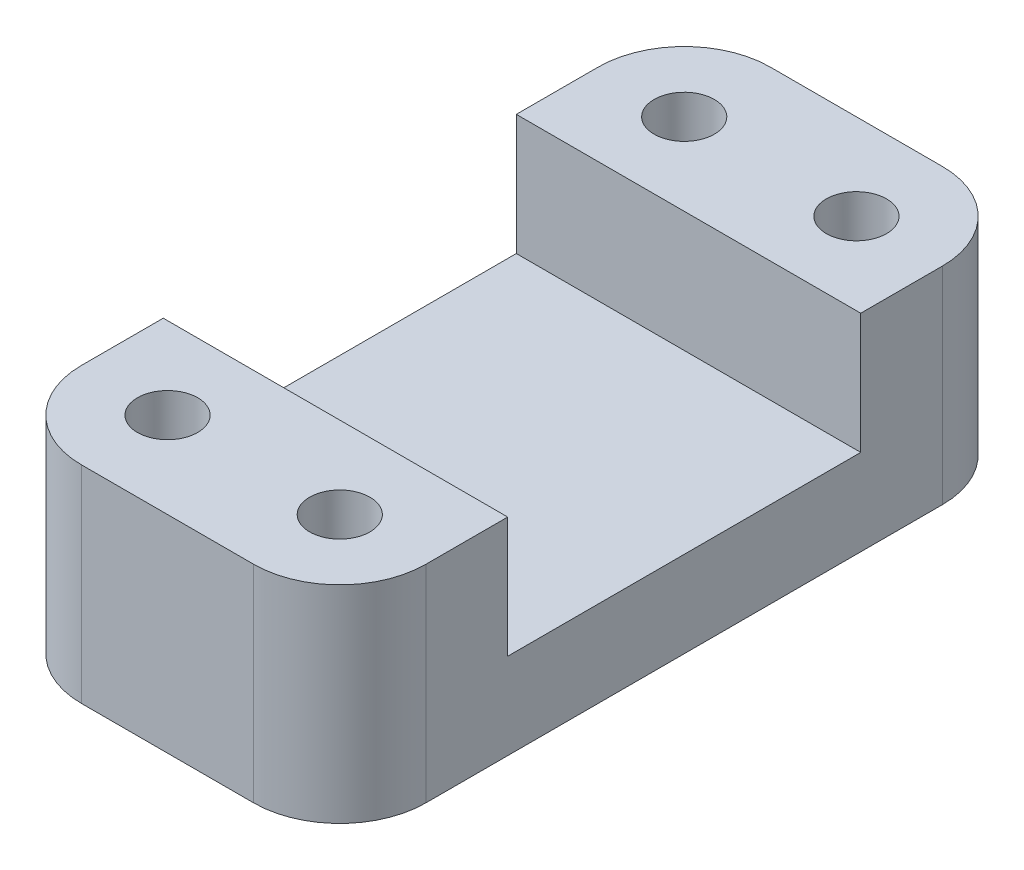
ISO-10303-21;
HEADER;
FILE_DESCRIPTION(('STEP AP214'),'2;1');
FILE_NAME('part.step','',(''),(''),'','','');
FILE_SCHEMA(('AUTOMOTIVE_DESIGN { 1 0 10303 214 1 1 1 1 }'));
ENDSEC;
DATA;
#1=APPLICATION_CONTEXT('core data for automotive mechanical design processes');
#2=APPLICATION_PROTOCOL_DEFINITION('international standard','automotive_design',2000,#1);
#3=PRODUCT_CONTEXT('',#1,'mechanical');
#4=PRODUCT('Part','Part','',(#3));
#5=PRODUCT_RELATED_PRODUCT_CATEGORY('part','',(#4));
#6=PRODUCT_DEFINITION_FORMATION('','',#4);
#7=PRODUCT_DEFINITION_CONTEXT('part definition',#1,'design');
#8=PRODUCT_DEFINITION('design','',#6,#7);
#9=PRODUCT_DEFINITION_SHAPE('','',#8);
#10=(LENGTH_UNIT() NAMED_UNIT(*) SI_UNIT(.MILLI.,.METRE.));
#11=(NAMED_UNIT(*) PLANE_ANGLE_UNIT() SI_UNIT($,.RADIAN.));
#12=(NAMED_UNIT(*) SI_UNIT($,.STERADIAN.) SOLID_ANGLE_UNIT());
#13=UNCERTAINTY_MEASURE_WITH_UNIT(LENGTH_MEASURE(1.E-05),#10,'distance_accuracy_value','');
#14=(GEOMETRIC_REPRESENTATION_CONTEXT(3) GLOBAL_UNCERTAINTY_ASSIGNED_CONTEXT((#13)) GLOBAL_UNIT_ASSIGNED_CONTEXT((#10,
#11,#12)) REPRESENTATION_CONTEXT('',''));
#15=CARTESIAN_POINT('',(0.,0.,0.));
#16=DIRECTION('',(0.,0.,1.));
#17=DIRECTION('',(1.,0.,0.));
#18=AXIS2_PLACEMENT_3D('',#15,#16,#17);
#19=CARTESIAN_POINT('',(0.,5.,0.));
#20=DIRECTION('',(0.,-1.,0.));
#21=DIRECTION('',(0.,0.,-1.));
#22=AXIS2_PLACEMENT_3D('',#19,#20,#21);
#23=PLANE('',#22);
#24=DIRECTION('',(1.,0.,0.));
#25=VECTOR('',#24,1.);
#26=CARTESIAN_POINT('',(10.,5.,-10.25));
#27=LINE('',#26,#25);
#28=CARTESIAN_POINT('',(-10.,5.,-10.25));
#29=VERTEX_POINT('',#28);
#30=CARTESIAN_POINT('',(10.,5.,-10.25));
#31=VERTEX_POINT('',#30);
#32=EDGE_CURVE('E153',#29,#31,#27,.T.);
#33=ORIENTED_EDGE('',*,*,#32,.F.);
#34=DIRECTION('',(0.,0.,1.));
#35=VECTOR('',#34,1.);
#36=CARTESIAN_POINT('',(-10.,5.,20.));
#37=LINE('',#36,#35);
#38=CARTESIAN_POINT('',(-10.,5.,10.25));
#39=VERTEX_POINT('',#38);
#40=EDGE_CURVE('E139',#29,#39,#37,.T.);
#41=ORIENTED_EDGE('',*,*,#40,.T.);
#42=DIRECTION('',(-1.,0.,0.));
#43=VECTOR('',#42,1.);
#44=CARTESIAN_POINT('',(-10.,5.,10.25));
#45=LINE('',#44,#43);
#46=CARTESIAN_POINT('',(10.,5.,10.25));
#47=VERTEX_POINT('',#46);
#48=EDGE_CURVE('E143',#47,#39,#45,.T.);
#49=ORIENTED_EDGE('',*,*,#48,.F.);
#50=DIRECTION('',(0.,0.,-1.));
#51=VECTOR('',#50,1.);
#52=CARTESIAN_POINT('',(10.,5.,20.));
#53=LINE('',#52,#51);
#54=EDGE_CURVE('E173',#47,#31,#53,.T.);
#55=ORIENTED_EDGE('',*,*,#54,.T.);
#56=EDGE_LOOP('',(#33,#41,#49,#55));
#57=FACE_BOUND('',#56,.T.);
#58=ADVANCED_FACE('F32',(#57),#23,.F.);
#59=CARTESIAN_POINT('',(10.,5.,20.));
#60=DIRECTION('',(-1.,0.,0.));
#61=DIRECTION('',(0.,0.,1.));
#62=AXIS2_PLACEMENT_3D('',#59,#60,#61);
#63=PLANE('',#62);
#64=DIRECTION('',(0.,0.,-1.));
#65=VECTOR('',#64,1.);
#66=CARTESIAN_POINT('',(10.,0.,20.));
#67=LINE('',#66,#65);
#68=CARTESIAN_POINT('',(10.,0.,15.));
#69=VERTEX_POINT('',#68);
#70=CARTESIAN_POINT('',(10.,0.,-15.));
#71=VERTEX_POINT('',#70);
#72=EDGE_CURVE('E172',#69,#71,#67,.T.);
#73=ORIENTED_EDGE('',*,*,#72,.T.);
#74=DIRECTION('',(0.,-1.,0.));
#75=VECTOR('',#74,1.);
#76=CARTESIAN_POINT('',(10.,5.,-15.));
#77=LINE('',#76,#75);
#78=CARTESIAN_POINT('',(10.,12.,-15.));
#79=VERTEX_POINT('',#78);
#80=EDGE_CURVE('E222',#71,#79,#77,.F.);
#81=ORIENTED_EDGE('',*,*,#80,.T.);
#82=DIRECTION('',(0.,0.,-1.));
#83=VECTOR('',#82,1.);
#84=CARTESIAN_POINT('',(10.,12.,-20.));
#85=LINE('',#84,#83);
#86=CARTESIAN_POINT('',(10.,12.,-10.25));
#87=VERTEX_POINT('',#86);
#88=EDGE_CURVE('E154',#87,#79,#85,.T.);
#89=ORIENTED_EDGE('',*,*,#88,.F.);
#90=DIRECTION('',(0.,-1.,0.));
#91=VECTOR('',#90,1.);
#92=CARTESIAN_POINT('',(10.,12.,-10.25));
#93=LINE('',#92,#91);
#94=EDGE_CURVE('E144',#87,#31,#93,.T.);
#95=ORIENTED_EDGE('',*,*,#94,.T.);
#96=ORIENTED_EDGE('',*,*,#54,.F.);
#97=DIRECTION('',(0.,-1.,0.));
#98=VECTOR('',#97,1.);
#99=CARTESIAN_POINT('',(10.,12.,10.25));
#100=LINE('',#99,#98);
#101=CARTESIAN_POINT('',(10.,12.,10.25));
#102=VERTEX_POINT('',#101);
#103=EDGE_CURVE('E169',#102,#47,#100,.T.);
#104=ORIENTED_EDGE('',*,*,#103,.F.);
#105=DIRECTION('',(0.,0.,-1.));
#106=VECTOR('',#105,1.);
#107=CARTESIAN_POINT('',(10.,12.,20.));
#108=LINE('',#107,#106);
#109=CARTESIAN_POINT('',(10.,12.,15.));
#110=VERTEX_POINT('',#109);
#111=EDGE_CURVE('E161',#110,#102,#108,.T.);
#112=ORIENTED_EDGE('',*,*,#111,.F.);
#113=DIRECTION('',(0.,-1.,0.));
#114=VECTOR('',#113,1.);
#115=CARTESIAN_POINT('',(10.,5.,15.));
#116=LINE('',#115,#114);
#117=EDGE_CURVE('E219',#110,#69,#116,.T.);
#118=ORIENTED_EDGE('',*,*,#117,.T.);
#119=EDGE_LOOP('',(#73,#81,#89,#95,#96,#104,#112,#118));
#120=FACE_BOUND('',#119,.T.);
#121=ADVANCED_FACE('F241',(#120),#63,.F.);
#122=CARTESIAN_POINT('',(-10.,5.,-20.));
#123=DIRECTION('',(0.,0.,1.));
#124=DIRECTION('',(1.,0.,0.));
#125=AXIS2_PLACEMENT_3D('',#122,#123,#124);
#126=PLANE('',#125);
#127=DIRECTION('',(-1.,0.,0.));
#128=VECTOR('',#127,1.);
#129=CARTESIAN_POINT('',(10.,12.,-20.));
#130=LINE('',#129,#128);
#131=CARTESIAN_POINT('',(5.,12.,-20.));
#132=VERTEX_POINT('',#131);
#133=CARTESIAN_POINT('',(-5.,12.,-20.));
#134=VERTEX_POINT('',#133);
#135=EDGE_CURVE('E133',#132,#134,#130,.T.);
#136=ORIENTED_EDGE('',*,*,#135,.F.);
#137=DIRECTION('',(0.,-1.,0.));
#138=VECTOR('',#137,1.);
#139=CARTESIAN_POINT('',(5.,5.,-20.));
#140=LINE('',#139,#138);
#141=CARTESIAN_POINT('',(5.,0.,-20.));
#142=VERTEX_POINT('',#141);
#143=EDGE_CURVE('E208',#132,#142,#140,.T.);
#144=ORIENTED_EDGE('',*,*,#143,.T.);
#145=DIRECTION('',(-1.,0.,0.));
#146=VECTOR('',#145,1.);
#147=CARTESIAN_POINT('',(-10.,0.,-20.));
#148=LINE('',#147,#146);
#149=CARTESIAN_POINT('',(-5.,0.,-20.));
#150=VERTEX_POINT('',#149);
#151=EDGE_CURVE('E180',#142,#150,#148,.T.);
#152=ORIENTED_EDGE('',*,*,#151,.T.);
#153=DIRECTION('',(0.,-1.,0.));
#154=VECTOR('',#153,1.);
#155=CARTESIAN_POINT('',(-5.,5.,-20.));
#156=LINE('',#155,#154);
#157=EDGE_CURVE('E177',#150,#134,#156,.F.);
#158=ORIENTED_EDGE('',*,*,#157,.T.);
#159=EDGE_LOOP('',(#136,#144,#152,#158));
#160=FACE_BOUND('',#159,.T.);
#161=ADVANCED_FACE('F261',(#160),#126,.F.);
#162=CARTESIAN_POINT('',(-10.,5.,20.));
#163=DIRECTION('',(1.,0.,0.));
#164=DIRECTION('',(0.,0.,-1.));
#165=AXIS2_PLACEMENT_3D('',#162,#163,#164);
#166=PLANE('',#165);
#167=DIRECTION('',(0.,0.,1.));
#168=VECTOR('',#167,1.);
#169=CARTESIAN_POINT('',(-10.,12.,-20.));
#170=LINE('',#169,#168);
#171=CARTESIAN_POINT('',(-10.,12.,-15.));
#172=VERTEX_POINT('',#171);
#173=CARTESIAN_POINT('',(-10.,12.,-10.25));
#174=VERTEX_POINT('',#173);
#175=EDGE_CURVE('E120',#172,#174,#170,.T.);
#176=ORIENTED_EDGE('',*,*,#175,.F.);
#177=DIRECTION('',(0.,-1.,0.));
#178=VECTOR('',#177,1.);
#179=CARTESIAN_POINT('',(-10.,5.,-15.));
#180=LINE('',#179,#178);
#181=CARTESIAN_POINT('',(-10.,0.,-15.));
#182=VERTEX_POINT('',#181);
#183=EDGE_CURVE('E229',#172,#182,#180,.T.);
#184=ORIENTED_EDGE('',*,*,#183,.T.);
#185=DIRECTION('',(0.,0.,1.));
#186=VECTOR('',#185,1.);
#187=CARTESIAN_POINT('',(-10.,0.,20.));
#188=LINE('',#187,#186);
#189=CARTESIAN_POINT('',(-10.,0.,15.));
#190=VERTEX_POINT('',#189);
#191=EDGE_CURVE('E183',#182,#190,#188,.T.);
#192=ORIENTED_EDGE('',*,*,#191,.T.);
#193=DIRECTION('',(0.,-1.,0.));
#194=VECTOR('',#193,1.);
#195=CARTESIAN_POINT('',(-10.,5.,15.));
#196=LINE('',#195,#194);
#197=CARTESIAN_POINT('',(-10.,12.,15.));
#198=VERTEX_POINT('',#197);
#199=EDGE_CURVE('E227',#190,#198,#196,.F.);
#200=ORIENTED_EDGE('',*,*,#199,.T.);
#201=DIRECTION('',(0.,0.,1.));
#202=VECTOR('',#201,1.);
#203=CARTESIAN_POINT('',(-10.,12.,20.));
#204=LINE('',#203,#202);
#205=CARTESIAN_POINT('',(-10.,12.,10.25));
#206=VERTEX_POINT('',#205);
#207=EDGE_CURVE('E157',#206,#198,#204,.T.);
#208=ORIENTED_EDGE('',*,*,#207,.F.);
#209=DIRECTION('',(0.,-1.,0.));
#210=VECTOR('',#209,1.);
#211=CARTESIAN_POINT('',(-10.,12.,10.25));
#212=LINE('',#211,#210);
#213=EDGE_CURVE('E165',#206,#39,#212,.T.);
#214=ORIENTED_EDGE('',*,*,#213,.T.);
#215=ORIENTED_EDGE('',*,*,#40,.F.);
#216=DIRECTION('',(0.,-1.,0.));
#217=VECTOR('',#216,1.);
#218=CARTESIAN_POINT('',(-10.,12.,-10.25));
#219=LINE('',#218,#217);
#220=EDGE_CURVE('E136',#174,#29,#219,.T.);
#221=ORIENTED_EDGE('',*,*,#220,.F.);
#222=EDGE_LOOP('',(#176,#184,#192,#200,#208,#214,#215,#221));
#223=FACE_BOUND('',#222,.T.);
#224=ADVANCED_FACE('F137',(#223),#166,.F.);
#225=CARTESIAN_POINT('',(-10.,5.,20.));
#226=DIRECTION('',(0.,0.,-1.));
#227=DIRECTION('',(-1.,0.,0.));
#228=AXIS2_PLACEMENT_3D('',#225,#226,#227);
#229=PLANE('',#228);
#230=DIRECTION('',(1.,0.,0.));
#231=VECTOR('',#230,1.);
#232=CARTESIAN_POINT('',(-10.,12.,20.));
#233=LINE('',#232,#231);
#234=CARTESIAN_POINT('',(-5.,12.,20.));
#235=VERTEX_POINT('',#234);
#236=CARTESIAN_POINT('',(5.,12.,20.));
#237=VERTEX_POINT('',#236);
#238=EDGE_CURVE('E159',#235,#237,#233,.T.);
#239=ORIENTED_EDGE('',*,*,#238,.F.);
#240=DIRECTION('',(0.,-1.,0.));
#241=VECTOR('',#240,1.);
#242=CARTESIAN_POINT('',(-5.,5.,20.));
#243=LINE('',#242,#241);
#244=CARTESIAN_POINT('',(-5.,0.,20.));
#245=VERTEX_POINT('',#244);
#246=EDGE_CURVE('E232',#235,#245,#243,.T.);
#247=ORIENTED_EDGE('',*,*,#246,.T.);
#248=DIRECTION('',(1.,0.,0.));
#249=VECTOR('',#248,1.);
#250=CARTESIAN_POINT('',(-10.,0.,20.));
#251=LINE('',#250,#249);
#252=CARTESIAN_POINT('',(5.,0.,20.));
#253=VERTEX_POINT('',#252);
#254=EDGE_CURVE('E175',#245,#253,#251,.T.);
#255=ORIENTED_EDGE('',*,*,#254,.T.);
#256=DIRECTION('',(0.,-1.,0.));
#257=VECTOR('',#256,1.);
#258=CARTESIAN_POINT('',(5.,5.,20.));
#259=LINE('',#258,#257);
#260=EDGE_CURVE('E47',#253,#237,#259,.F.);
#261=ORIENTED_EDGE('',*,*,#260,.T.);
#262=EDGE_LOOP('',(#239,#247,#255,#261));
#263=FACE_BOUND('',#262,.T.);
#264=ADVANCED_FACE('F249',(#263),#229,.F.);
#265=CARTESIAN_POINT('',(0.,0.,0.));
#266=DIRECTION('',(0.,-1.,0.));
#267=DIRECTION('',(0.,0.,-1.));
#268=AXIS2_PLACEMENT_3D('',#265,#266,#267);
#269=PLANE('',#268);
#270=CARTESIAN_POINT('',(5.,0.,15.));
#271=DIRECTION('',(0.,-1.,0.));
#272=DIRECTION('',(0.,0.,-1.));
#273=AXIS2_PLACEMENT_3D('',#270,#271,#272);
#274=CIRCLE('',#273,3.25);
#275=CARTESIAN_POINT('',(5.,0.,11.75));
#276=VERTEX_POINT('',#275);
#277=EDGE_CURVE('E293',#276,#276,#274,.T.);
#278=ORIENTED_EDGE('',*,*,#277,.F.);
#279=EDGE_LOOP('',(#278));
#280=FACE_BOUND('',#279,.T.);
#281=CARTESIAN_POINT('',(-5.,0.,15.));
#282=DIRECTION('',(0.,-1.,0.));
#283=DIRECTION('',(0.,0.,-1.));
#284=AXIS2_PLACEMENT_3D('',#281,#282,#283);
#285=CIRCLE('',#284,3.25);
#286=CARTESIAN_POINT('',(-5.,0.,11.75));
#287=VERTEX_POINT('',#286);
#288=EDGE_CURVE('E205',#287,#287,#285,.T.);
#289=ORIENTED_EDGE('',*,*,#288,.F.);
#290=EDGE_LOOP('',(#289));
#291=FACE_BOUND('',#290,.T.);
#292=CARTESIAN_POINT('',(-5.,0.,-15.));
#293=DIRECTION('',(0.,-1.,0.));
#294=DIRECTION('',(0.,0.,-1.));
#295=AXIS2_PLACEMENT_3D('',#292,#293,#294);
#296=CIRCLE('',#295,3.25);
#297=CARTESIAN_POINT('',(-5.,0.,-18.25));
#298=VERTEX_POINT('',#297);
#299=EDGE_CURVE('E200',#298,#298,#296,.T.);
#300=ORIENTED_EDGE('',*,*,#299,.F.);
#301=EDGE_LOOP('',(#300));
#302=FACE_BOUND('',#301,.T.);
#303=CARTESIAN_POINT('',(5.,0.,-15.));
#304=DIRECTION('',(0.,-1.,0.));
#305=DIRECTION('',(0.,0.,-1.));
#306=AXIS2_PLACEMENT_3D('',#303,#304,#305);
#307=CIRCLE('',#306,3.25);
#308=CARTESIAN_POINT('',(5.,0.,-18.25));
#309=VERTEX_POINT('',#308);
#310=EDGE_CURVE('E195',#309,#309,#307,.T.);
#311=ORIENTED_EDGE('',*,*,#310,.F.);
#312=EDGE_LOOP('',(#311));
#313=FACE_BOUND('',#312,.T.);
#314=ORIENTED_EDGE('',*,*,#151,.F.);
#315=CARTESIAN_POINT('',(5.,0.,-15.));
#316=DIRECTION('',(0.,-1.,0.));
#317=DIRECTION('',(0.,0.,-1.));
#318=AXIS2_PLACEMENT_3D('',#315,#316,#317);
#319=CIRCLE('',#318,5.);
#320=EDGE_CURVE('E217',#142,#71,#319,.T.);
#321=ORIENTED_EDGE('',*,*,#320,.T.);
#322=ORIENTED_EDGE('',*,*,#72,.F.);
#323=CARTESIAN_POINT('',(5.,0.,15.));
#324=DIRECTION('',(0.,-1.,0.));
#325=DIRECTION('',(0.,0.,-1.));
#326=AXIS2_PLACEMENT_3D('',#323,#324,#325);
#327=CIRCLE('',#326,5.);
#328=EDGE_CURVE('E211',#69,#253,#327,.T.);
#329=ORIENTED_EDGE('',*,*,#328,.T.);
#330=ORIENTED_EDGE('',*,*,#254,.F.);
#331=CARTESIAN_POINT('',(-5.,0.,15.));
#332=DIRECTION('',(0.,-1.,0.));
#333=DIRECTION('',(0.,0.,-1.));
#334=AXIS2_PLACEMENT_3D('',#331,#332,#333);
#335=CIRCLE('',#334,5.);
#336=EDGE_CURVE('E213',#245,#190,#335,.T.);
#337=ORIENTED_EDGE('',*,*,#336,.T.);
#338=ORIENTED_EDGE('',*,*,#191,.F.);
#339=CARTESIAN_POINT('',(-5.,0.,-15.));
#340=DIRECTION('',(0.,-1.,0.));
#341=DIRECTION('',(0.,0.,-1.));
#342=AXIS2_PLACEMENT_3D('',#339,#340,#341);
#343=CIRCLE('',#342,5.);
#344=EDGE_CURVE('E215',#182,#150,#343,.T.);
#345=ORIENTED_EDGE('',*,*,#344,.T.);
#346=EDGE_LOOP('',(#314,#321,#322,#329,#330,#337,#338,#345));
#347=FACE_BOUND('',#346,.T.);
#348=ADVANCED_FACE('F248',(#280,#291,#302,#313,#347),#269,.T.);
#349=CARTESIAN_POINT('',(-10.,12.,10.25));
#350=DIRECTION('',(0.,0.,1.));
#351=DIRECTION('',(1.,0.,0.));
#352=AXIS2_PLACEMENT_3D('',#349,#350,#351);
#353=PLANE('',#352);
#354=ORIENTED_EDGE('',*,*,#48,.T.);
#355=ORIENTED_EDGE('',*,*,#213,.F.);
#356=DIRECTION('',(-1.,0.,0.));
#357=VECTOR('',#356,1.);
#358=CARTESIAN_POINT('',(-10.,12.,10.25));
#359=LINE('',#358,#357);
#360=EDGE_CURVE('E163',#102,#206,#359,.T.);
#361=ORIENTED_EDGE('',*,*,#360,.F.);
#362=ORIENTED_EDGE('',*,*,#103,.T.);
#363=EDGE_LOOP('',(#354,#355,#361,#362));
#364=FACE_BOUND('',#363,.T.);
#365=ADVANCED_FACE('F301',(#364),#353,.F.);
#366=CARTESIAN_POINT('',(0.,12.,0.));
#367=DIRECTION('',(0.,-1.,0.));
#368=DIRECTION('',(0.,0.,-1.));
#369=AXIS2_PLACEMENT_3D('',#366,#367,#368);
#370=PLANE('',#369);
#371=CARTESIAN_POINT('',(-5.,12.,15.));
#372=DIRECTION('',(0.,-1.,0.));
#373=DIRECTION('',(0.,0.,-1.));
#374=AXIS2_PLACEMENT_3D('',#371,#372,#373);
#375=CIRCLE('',#374,1.75);
#376=CARTESIAN_POINT('',(-5.,12.,13.25));
#377=VERTEX_POINT('',#376);
#378=EDGE_CURVE('E271',#377,#377,#375,.T.);
#379=ORIENTED_EDGE('',*,*,#378,.T.);
#380=EDGE_LOOP('',(#379));
#381=FACE_BOUND('',#380,.T.);
#382=CARTESIAN_POINT('',(5.,12.,15.));
#383=DIRECTION('',(0.,-1.,0.));
#384=DIRECTION('',(0.,0.,-1.));
#385=AXIS2_PLACEMENT_3D('',#382,#383,#384);
#386=CIRCLE('',#385,1.75);
#387=CARTESIAN_POINT('',(5.,12.,13.25));
#388=VERTEX_POINT('',#387);
#389=EDGE_CURVE('E155',#388,#388,#386,.T.);
#390=ORIENTED_EDGE('',*,*,#389,.T.);
#391=EDGE_LOOP('',(#390));
#392=FACE_BOUND('',#391,.T.);
#393=ORIENTED_EDGE('',*,*,#207,.T.);
#394=CARTESIAN_POINT('',(-5.,12.,15.));
#395=DIRECTION('',(0.,-1.,0.));
#396=DIRECTION('',(0.,0.,-1.));
#397=AXIS2_PLACEMENT_3D('',#394,#395,#396);
#398=CIRCLE('',#397,5.);
#399=EDGE_CURVE('E11',#198,#235,#398,.F.);
#400=ORIENTED_EDGE('',*,*,#399,.T.);
#401=ORIENTED_EDGE('',*,*,#238,.T.);
#402=CARTESIAN_POINT('',(5.,12.,15.));
#403=DIRECTION('',(0.,-1.,0.));
#404=DIRECTION('',(0.,0.,-1.));
#405=AXIS2_PLACEMENT_3D('',#402,#403,#404);
#406=CIRCLE('',#405,5.);
#407=EDGE_CURVE('E40',#237,#110,#406,.F.);
#408=ORIENTED_EDGE('',*,*,#407,.T.);
#409=ORIENTED_EDGE('',*,*,#111,.T.);
#410=ORIENTED_EDGE('',*,*,#360,.T.);
#411=EDGE_LOOP('',(#393,#400,#401,#408,#409,#410));
#412=FACE_BOUND('',#411,.T.);
#413=ADVANCED_FACE('F236',(#381,#392,#412),#370,.F.);
#414=CARTESIAN_POINT('',(10.,12.,-10.25));
#415=DIRECTION('',(0.,0.,-1.));
#416=DIRECTION('',(-1.,0.,0.));
#417=AXIS2_PLACEMENT_3D('',#414,#415,#416);
#418=PLANE('',#417);
#419=ORIENTED_EDGE('',*,*,#32,.T.);
#420=ORIENTED_EDGE('',*,*,#94,.F.);
#421=DIRECTION('',(1.,0.,0.));
#422=VECTOR('',#421,1.);
#423=CARTESIAN_POINT('',(10.,12.,-10.25));
#424=LINE('',#423,#422);
#425=EDGE_CURVE('E125',#174,#87,#424,.T.);
#426=ORIENTED_EDGE('',*,*,#425,.F.);
#427=ORIENTED_EDGE('',*,*,#220,.T.);
#428=EDGE_LOOP('',(#419,#420,#426,#427));
#429=FACE_BOUND('',#428,.T.);
#430=ADVANCED_FACE('F146',(#429),#418,.F.);
#431=CARTESIAN_POINT('',(0.,12.,0.));
#432=DIRECTION('',(0.,-1.,0.));
#433=DIRECTION('',(0.,0.,-1.));
#434=AXIS2_PLACEMENT_3D('',#431,#432,#433);
#435=PLANE('',#434);
#436=CARTESIAN_POINT('',(5.,12.,-15.));
#437=DIRECTION('',(0.,-1.,0.));
#438=DIRECTION('',(0.,0.,-1.));
#439=AXIS2_PLACEMENT_3D('',#436,#437,#438);
#440=CIRCLE('',#439,1.75);
#441=CARTESIAN_POINT('',(5.,12.,-16.75));
#442=VERTEX_POINT('',#441);
#443=EDGE_CURVE('E190',#442,#442,#440,.T.);
#444=ORIENTED_EDGE('',*,*,#443,.T.);
#445=EDGE_LOOP('',(#444));
#446=FACE_BOUND('',#445,.T.);
#447=CARTESIAN_POINT('',(-5.,12.,-15.));
#448=DIRECTION('',(0.,-1.,0.));
#449=DIRECTION('',(0.,0.,-1.));
#450=AXIS2_PLACEMENT_3D('',#447,#448,#449);
#451=CIRCLE('',#450,1.75);
#452=CARTESIAN_POINT('',(-5.,12.,-16.75));
#453=VERTEX_POINT('',#452);
#454=EDGE_CURVE('E274',#453,#453,#451,.T.);
#455=ORIENTED_EDGE('',*,*,#454,.T.);
#456=EDGE_LOOP('',(#455));
#457=FACE_BOUND('',#456,.T.);
#458=ORIENTED_EDGE('',*,*,#88,.T.);
#459=CARTESIAN_POINT('',(5.,12.,-15.));
#460=DIRECTION('',(0.,-1.,0.));
#461=DIRECTION('',(0.,0.,-1.));
#462=AXIS2_PLACEMENT_3D('',#459,#460,#461);
#463=CIRCLE('',#462,5.);
#464=EDGE_CURVE('E225',#79,#132,#463,.F.);
#465=ORIENTED_EDGE('',*,*,#464,.T.);
#466=ORIENTED_EDGE('',*,*,#135,.T.);
#467=CARTESIAN_POINT('',(-5.,12.,-15.));
#468=DIRECTION('',(0.,-1.,0.));
#469=DIRECTION('',(0.,0.,-1.));
#470=AXIS2_PLACEMENT_3D('',#467,#468,#469);
#471=CIRCLE('',#470,5.);
#472=EDGE_CURVE('E129',#134,#172,#471,.F.);
#473=ORIENTED_EDGE('',*,*,#472,.T.);
#474=ORIENTED_EDGE('',*,*,#175,.T.);
#475=ORIENTED_EDGE('',*,*,#425,.T.);
#476=EDGE_LOOP('',(#458,#465,#466,#473,#474,#475));
#477=FACE_BOUND('',#476,.T.);
#478=ADVANCED_FACE('F123',(#446,#457,#477),#435,.F.);
#479=CARTESIAN_POINT('',(-5.,12.,-15.));
#480=DIRECTION('',(0.,-1.,0.));
#481=DIRECTION('',(0.,0.,-1.));
#482=AXIS2_PLACEMENT_3D('',#479,#480,#481);
#483=CYLINDRICAL_SURFACE('',#482,1.75);
#484=CARTESIAN_POINT('',(-5.,3.4,-15.));
#485=DIRECTION('',(0.,1.,0.));
#486=DIRECTION('',(0.,0.,1.));
#487=AXIS2_PLACEMENT_3D('',#484,#485,#486);
#488=CIRCLE('',#487,1.75);
#489=CARTESIAN_POINT('',(-5.,3.4,-13.25));
#490=VERTEX_POINT('',#489);
#491=EDGE_CURVE('E192',#490,#490,#488,.F.);
#492=ORIENTED_EDGE('',*,*,#491,.T.);
#493=EDGE_LOOP('',(#492));
#494=FACE_BOUND('',#493,.T.);
#495=ORIENTED_EDGE('',*,*,#454,.F.);
#496=EDGE_LOOP('',(#495));
#497=FACE_BOUND('',#496,.T.);
#498=ADVANCED_FACE('F378',(#494,#497),#483,.F.);
#499=CARTESIAN_POINT('',(5.,12.,-15.));
#500=DIRECTION('',(0.,-1.,0.));
#501=DIRECTION('',(0.,0.,-1.));
#502=AXIS2_PLACEMENT_3D('',#499,#500,#501);
#503=CYLINDRICAL_SURFACE('',#502,1.75);
#504=CARTESIAN_POINT('',(5.,3.4,-15.));
#505=DIRECTION('',(0.,1.,0.));
#506=DIRECTION('',(0.,0.,1.));
#507=AXIS2_PLACEMENT_3D('',#504,#505,#506);
#508=CIRCLE('',#507,1.75);
#509=CARTESIAN_POINT('',(5.,3.4,-13.25));
#510=VERTEX_POINT('',#509);
#511=EDGE_CURVE('E187',#510,#510,#508,.F.);
#512=ORIENTED_EDGE('',*,*,#511,.T.);
#513=EDGE_LOOP('',(#512));
#514=FACE_BOUND('',#513,.T.);
#515=ORIENTED_EDGE('',*,*,#443,.F.);
#516=EDGE_LOOP('',(#515));
#517=FACE_BOUND('',#516,.T.);
#518=ADVANCED_FACE('F509',(#514,#517),#503,.F.);
#519=CARTESIAN_POINT('',(5.,12.,15.));
#520=DIRECTION('',(0.,-1.,0.));
#521=DIRECTION('',(0.,0.,-1.));
#522=AXIS2_PLACEMENT_3D('',#519,#520,#521);
#523=CYLINDRICAL_SURFACE('',#522,1.75);
#524=CARTESIAN_POINT('',(5.,3.4,15.));
#525=DIRECTION('',(0.,1.,0.));
#526=DIRECTION('',(0.,0.,1.));
#527=AXIS2_PLACEMENT_3D('',#524,#525,#526);
#528=CIRCLE('',#527,1.75);
#529=CARTESIAN_POINT('',(5.,3.4,16.75));
#530=VERTEX_POINT('',#529);
#531=EDGE_CURVE('E202',#530,#530,#528,.F.);
#532=ORIENTED_EDGE('',*,*,#531,.T.);
#533=EDGE_LOOP('',(#532));
#534=FACE_BOUND('',#533,.T.);
#535=ORIENTED_EDGE('',*,*,#389,.F.);
#536=EDGE_LOOP('',(#535));
#537=FACE_BOUND('',#536,.T.);
#538=ADVANCED_FACE('F499',(#534,#537),#523,.F.);
#539=CARTESIAN_POINT('',(-5.,12.,15.));
#540=DIRECTION('',(0.,-1.,0.));
#541=DIRECTION('',(0.,0.,-1.));
#542=AXIS2_PLACEMENT_3D('',#539,#540,#541);
#543=CYLINDRICAL_SURFACE('',#542,1.75);
#544=CARTESIAN_POINT('',(-5.,3.4,15.));
#545=DIRECTION('',(0.,1.,0.));
#546=DIRECTION('',(0.,0.,1.));
#547=AXIS2_PLACEMENT_3D('',#544,#545,#546);
#548=CIRCLE('',#547,1.75);
#549=CARTESIAN_POINT('',(-5.,3.4,16.75));
#550=VERTEX_POINT('',#549);
#551=EDGE_CURVE('E197',#550,#550,#548,.F.);
#552=ORIENTED_EDGE('',*,*,#551,.T.);
#553=EDGE_LOOP('',(#552));
#554=FACE_BOUND('',#553,.T.);
#555=ORIENTED_EDGE('',*,*,#378,.F.);
#556=EDGE_LOOP('',(#555));
#557=FACE_BOUND('',#556,.T.);
#558=ADVANCED_FACE('F322',(#554,#557),#543,.F.);
#559=CARTESIAN_POINT('',(6.7,3.4,-15.));
#560=DIRECTION('',(0.,1.,0.));
#561=DIRECTION('',(0.,0.,1.));
#562=AXIS2_PLACEMENT_3D('',#559,#560,#561);
#563=PLANE('',#562);
#564=CARTESIAN_POINT('',(5.,3.4,-15.));
#565=DIRECTION('',(0.,-1.,0.));
#566=DIRECTION('',(0.,0.,-1.));
#567=AXIS2_PLACEMENT_3D('',#564,#565,#566);
#568=CIRCLE('',#567,3.25);
#569=CARTESIAN_POINT('',(5.,3.4,-18.25));
#570=VERTEX_POINT('',#569);
#571=EDGE_CURVE('E191',#570,#570,#568,.T.);
#572=ORIENTED_EDGE('',*,*,#571,.T.);
#573=EDGE_LOOP('',(#572));
#574=FACE_BOUND('',#573,.T.);
#575=ORIENTED_EDGE('',*,*,#511,.F.);
#576=EDGE_LOOP('',(#575));
#577=FACE_BOUND('',#576,.T.);
#578=ADVANCED_FACE('F312',(#574,#577),#563,.F.);
#579=CARTESIAN_POINT('',(5.,0.,-15.));
#580=DIRECTION('',(0.,-1.,0.));
#581=DIRECTION('',(0.,0.,-1.));
#582=AXIS2_PLACEMENT_3D('',#579,#580,#581);
#583=CYLINDRICAL_SURFACE('',#582,3.25);
#584=ORIENTED_EDGE('',*,*,#571,.F.);
#585=EDGE_LOOP('',(#584));
#586=FACE_BOUND('',#585,.T.);
#587=ORIENTED_EDGE('',*,*,#310,.T.);
#588=EDGE_LOOP('',(#587));
#589=FACE_BOUND('',#588,.T.);
#590=ADVANCED_FACE('F309',(#586,#589),#583,.F.);
#591=CARTESIAN_POINT('',(-3.3,3.4,-15.));
#592=DIRECTION('',(0.,1.,0.));
#593=DIRECTION('',(0.,0.,1.));
#594=AXIS2_PLACEMENT_3D('',#591,#592,#593);
#595=PLANE('',#594);
#596=CARTESIAN_POINT('',(-5.,3.4,-15.));
#597=DIRECTION('',(0.,-1.,0.));
#598=DIRECTION('',(0.,0.,-1.));
#599=AXIS2_PLACEMENT_3D('',#596,#597,#598);
#600=CIRCLE('',#599,3.25);
#601=CARTESIAN_POINT('',(-5.,3.4,-18.25));
#602=VERTEX_POINT('',#601);
#603=EDGE_CURVE('E196',#602,#602,#600,.T.);
#604=ORIENTED_EDGE('',*,*,#603,.T.);
#605=EDGE_LOOP('',(#604));
#606=FACE_BOUND('',#605,.T.);
#607=ORIENTED_EDGE('',*,*,#491,.F.);
#608=EDGE_LOOP('',(#607));
#609=FACE_BOUND('',#608,.T.);
#610=ADVANCED_FACE('F311',(#606,#609),#595,.F.);
#611=CARTESIAN_POINT('',(-5.,0.,-15.));
#612=DIRECTION('',(0.,-1.,0.));
#613=DIRECTION('',(0.,0.,-1.));
#614=AXIS2_PLACEMENT_3D('',#611,#612,#613);
#615=CYLINDRICAL_SURFACE('',#614,3.25);
#616=ORIENTED_EDGE('',*,*,#603,.F.);
#617=EDGE_LOOP('',(#616));
#618=FACE_BOUND('',#617,.T.);
#619=ORIENTED_EDGE('',*,*,#299,.T.);
#620=EDGE_LOOP('',(#619));
#621=FACE_BOUND('',#620,.T.);
#622=ADVANCED_FACE('F319',(#618,#621),#615,.F.);
#623=CARTESIAN_POINT('',(-3.3,3.4,15.));
#624=DIRECTION('',(0.,1.,0.));
#625=DIRECTION('',(0.,0.,1.));
#626=AXIS2_PLACEMENT_3D('',#623,#624,#625);
#627=PLANE('',#626);
#628=CARTESIAN_POINT('',(-5.,3.4,15.));
#629=DIRECTION('',(0.,-1.,0.));
#630=DIRECTION('',(0.,0.,-1.));
#631=AXIS2_PLACEMENT_3D('',#628,#629,#630);
#632=CIRCLE('',#631,3.25);
#633=CARTESIAN_POINT('',(-5.,3.4,11.75));
#634=VERTEX_POINT('',#633);
#635=EDGE_CURVE('E201',#634,#634,#632,.T.);
#636=ORIENTED_EDGE('',*,*,#635,.T.);
#637=EDGE_LOOP('',(#636));
#638=FACE_BOUND('',#637,.T.);
#639=ORIENTED_EDGE('',*,*,#551,.F.);
#640=EDGE_LOOP('',(#639));
#641=FACE_BOUND('',#640,.T.);
#642=ADVANCED_FACE('F455',(#638,#641),#627,.F.);
#643=CARTESIAN_POINT('',(-5.,0.,15.));
#644=DIRECTION('',(0.,-1.,0.));
#645=DIRECTION('',(0.,0.,-1.));
#646=AXIS2_PLACEMENT_3D('',#643,#644,#645);
#647=CYLINDRICAL_SURFACE('',#646,3.25);
#648=ORIENTED_EDGE('',*,*,#635,.F.);
#649=EDGE_LOOP('',(#648));
#650=FACE_BOUND('',#649,.T.);
#651=ORIENTED_EDGE('',*,*,#288,.T.);
#652=EDGE_LOOP('',(#651));
#653=FACE_BOUND('',#652,.T.);
#654=ADVANCED_FACE('F445',(#650,#653),#647,.F.);
#655=CARTESIAN_POINT('',(6.7,3.4,15.));
#656=DIRECTION('',(0.,1.,0.));
#657=DIRECTION('',(0.,0.,1.));
#658=AXIS2_PLACEMENT_3D('',#655,#656,#657);
#659=PLANE('',#658);
#660=CARTESIAN_POINT('',(5.,3.4,15.));
#661=DIRECTION('',(0.,-1.,0.));
#662=DIRECTION('',(0.,0.,-1.));
#663=AXIS2_PLACEMENT_3D('',#660,#661,#662);
#664=CIRCLE('',#663,3.25);
#665=CARTESIAN_POINT('',(5.,3.4,11.75));
#666=VERTEX_POINT('',#665);
#667=EDGE_CURVE('E206',#666,#666,#664,.T.);
#668=ORIENTED_EDGE('',*,*,#667,.T.);
#669=EDGE_LOOP('',(#668));
#670=FACE_BOUND('',#669,.T.);
#671=ORIENTED_EDGE('',*,*,#531,.F.);
#672=EDGE_LOOP('',(#671));
#673=FACE_BOUND('',#672,.T.);
#674=ADVANCED_FACE('F435',(#670,#673),#659,.F.);
#675=CARTESIAN_POINT('',(5.,0.,15.));
#676=DIRECTION('',(0.,-1.,0.));
#677=DIRECTION('',(0.,0.,-1.));
#678=AXIS2_PLACEMENT_3D('',#675,#676,#677);
#679=CYLINDRICAL_SURFACE('',#678,3.25);
#680=ORIENTED_EDGE('',*,*,#667,.F.);
#681=EDGE_LOOP('',(#680));
#682=FACE_BOUND('',#681,.T.);
#683=ORIENTED_EDGE('',*,*,#277,.T.);
#684=EDGE_LOOP('',(#683));
#685=FACE_BOUND('',#684,.T.);
#686=ADVANCED_FACE('F297',(#682,#685),#679,.F.);
#687=CARTESIAN_POINT('',(5.,5.,-15.));
#688=DIRECTION('',(0.,-1.,0.));
#689=DIRECTION('',(0.,0.,-1.));
#690=AXIS2_PLACEMENT_3D('',#687,#688,#689);
#691=CYLINDRICAL_SURFACE('',#690,5.);
#692=ORIENTED_EDGE('',*,*,#464,.F.);
#693=ORIENTED_EDGE('',*,*,#80,.F.);
#694=ORIENTED_EDGE('',*,*,#320,.F.);
#695=ORIENTED_EDGE('',*,*,#143,.F.);
#696=EDGE_LOOP('',(#692,#693,#694,#695));
#697=FACE_BOUND('',#696,.T.);
#698=ADVANCED_FACE('F265',(#697),#691,.T.);
#699=CARTESIAN_POINT('',(-5.,5.,-15.));
#700=DIRECTION('',(0.,-1.,0.));
#701=DIRECTION('',(0.,0.,-1.));
#702=AXIS2_PLACEMENT_3D('',#699,#700,#701);
#703=CYLINDRICAL_SURFACE('',#702,5.);
#704=ORIENTED_EDGE('',*,*,#472,.F.);
#705=ORIENTED_EDGE('',*,*,#157,.F.);
#706=ORIENTED_EDGE('',*,*,#344,.F.);
#707=ORIENTED_EDGE('',*,*,#183,.F.);
#708=EDGE_LOOP('',(#704,#705,#706,#707));
#709=FACE_BOUND('',#708,.T.);
#710=ADVANCED_FACE('F257',(#709),#703,.T.);
#711=CARTESIAN_POINT('',(-5.,5.,15.));
#712=DIRECTION('',(0.,-1.,0.));
#713=DIRECTION('',(0.,0.,-1.));
#714=AXIS2_PLACEMENT_3D('',#711,#712,#713);
#715=CYLINDRICAL_SURFACE('',#714,5.);
#716=ORIENTED_EDGE('',*,*,#399,.F.);
#717=ORIENTED_EDGE('',*,*,#199,.F.);
#718=ORIENTED_EDGE('',*,*,#336,.F.);
#719=ORIENTED_EDGE('',*,*,#246,.F.);
#720=EDGE_LOOP('',(#716,#717,#718,#719));
#721=FACE_BOUND('',#720,.T.);
#722=ADVANCED_FACE('F252',(#721),#715,.T.);
#723=CARTESIAN_POINT('',(5.,5.,15.));
#724=DIRECTION('',(0.,-1.,0.));
#725=DIRECTION('',(0.,0.,-1.));
#726=AXIS2_PLACEMENT_3D('',#723,#724,#725);
#727=CYLINDRICAL_SURFACE('',#726,5.);
#728=ORIENTED_EDGE('',*,*,#407,.F.);
#729=ORIENTED_EDGE('',*,*,#260,.F.);
#730=ORIENTED_EDGE('',*,*,#328,.F.);
#731=ORIENTED_EDGE('',*,*,#117,.F.);
#732=EDGE_LOOP('',(#728,#729,#730,#731));
#733=FACE_BOUND('',#732,.T.);
#734=ADVANCED_FACE('F34',(#733),#727,.T.);
#735=CLOSED_SHELL('',(#58,#121,#161,#224,#264,#348,#365,#413,#430,#478,#498,#518,#538,#558,#578,
#590,#610,#622,#642,#654,#674,#686,#698,#710,#722,#734));
#736=MANIFOLD_SOLID_BREP('B2',#735);
#737=ADVANCED_BREP_SHAPE_REPRESENTATION('',(#18,#736),#14);
#738=SHAPE_DEFINITION_REPRESENTATION(#9,#737);
ENDSEC;
END-ISO-10303-21;
